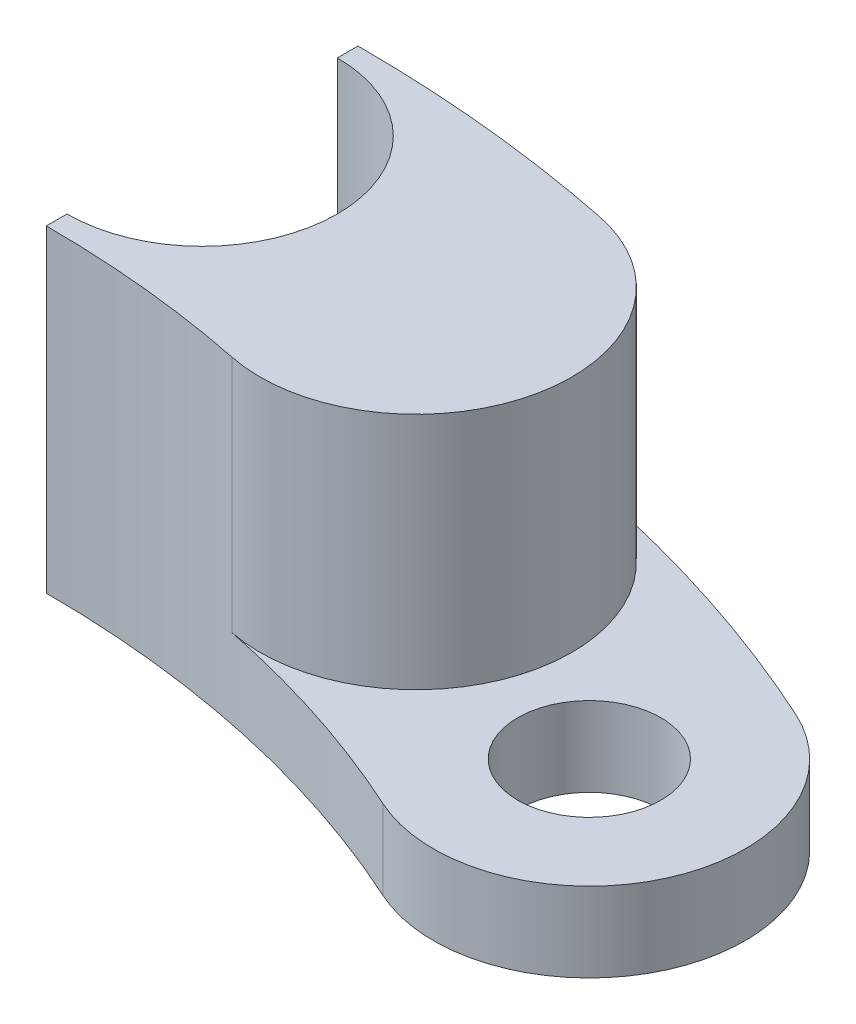
ISO-10303-21;
HEADER;
FILE_DESCRIPTION(('STEP AP214'),'2;1');
FILE_NAME('part.step','',(''),(''),'','','');
FILE_SCHEMA(('AUTOMOTIVE_DESIGN { 1 0 10303 214 1 1 1 1 }'));
ENDSEC;
DATA;
#1=APPLICATION_CONTEXT('core data for automotive mechanical design processes');
#2=APPLICATION_PROTOCOL_DEFINITION('international standard','automotive_design',2000,#1);
#3=PRODUCT_CONTEXT('',#1,'mechanical');
#4=PRODUCT('Part','Part','',(#3));
#5=PRODUCT_RELATED_PRODUCT_CATEGORY('part','',(#4));
#6=PRODUCT_DEFINITION_FORMATION('','',#4);
#7=PRODUCT_DEFINITION_CONTEXT('part definition',#1,'design');
#8=PRODUCT_DEFINITION('design','',#6,#7);
#9=PRODUCT_DEFINITION_SHAPE('','',#8);
#10=(LENGTH_UNIT() NAMED_UNIT(*) SI_UNIT(.MILLI.,.METRE.));
#11=(NAMED_UNIT(*) PLANE_ANGLE_UNIT() SI_UNIT($,.RADIAN.));
#12=(NAMED_UNIT(*) SI_UNIT($,.STERADIAN.) SOLID_ANGLE_UNIT());
#13=UNCERTAINTY_MEASURE_WITH_UNIT(LENGTH_MEASURE(1.E-05),#10,'distance_accuracy_value','');
#14=(GEOMETRIC_REPRESENTATION_CONTEXT(3) GLOBAL_UNCERTAINTY_ASSIGNED_CONTEXT((#13)) GLOBAL_UNIT_ASSIGNED_CONTEXT((#10,
#11,#12)) REPRESENTATION_CONTEXT('',''));
#15=CARTESIAN_POINT('',(0.,0.,0.));
#16=DIRECTION('',(0.,0.,1.));
#17=DIRECTION('',(1.,0.,0.));
#18=AXIS2_PLACEMENT_3D('',#15,#16,#17);
#19=CARTESIAN_POINT('',(0.,10.,0.));
#20=DIRECTION('',(0.,-1.,0.));
#21=DIRECTION('',(0.,0.,-1.));
#22=AXIS2_PLACEMENT_3D('',#19,#20,#21);
#23=CYLINDRICAL_SURFACE('',#22,32.6);
#24=CARTESIAN_POINT('',(0.,2.5,0.));
#25=DIRECTION('',(0.,1.,0.));
#26=DIRECTION('',(0.,0.,1.));
#27=AXIS2_PLACEMENT_3D('',#24,#25,#26);
#28=CIRCLE('',#27,32.6);
#29=CARTESIAN_POINT('',(6.49939466200064,2.5,-31.945545370639));
#30=VERTEX_POINT('',#29);
#31=CARTESIAN_POINT('',(13.5189997105934,2.5,-29.6647374305753));
#32=VERTEX_POINT('',#31);
#33=EDGE_CURVE('E124',#30,#32,#28,.F.);
#34=ORIENTED_EDGE('',*,*,#33,.F.);
#35=DIRECTION('',(0.,1.,0.));
#36=VECTOR('',#35,1.);
#37=CARTESIAN_POINT('',(6.49939466200064,2.5,-31.945545370639));
#38=LINE('',#37,#36);
#39=CARTESIAN_POINT('',(6.49939466200064,10.,-31.945545370639));
#40=VERTEX_POINT('',#39);
#41=EDGE_CURVE('E111',#30,#40,#38,.T.);
#42=ORIENTED_EDGE('',*,*,#41,.T.);
#43=CARTESIAN_POINT('',(0.,10.,0.));
#44=DIRECTION('',(0.,1.,0.));
#45=DIRECTION('',(0.,0.,1.));
#46=AXIS2_PLACEMENT_3D('',#43,#44,#45);
#47=CIRCLE('',#46,32.6);
#48=CARTESIAN_POINT('',(0.,10.,-32.6));
#49=VERTEX_POINT('',#48);
#50=EDGE_CURVE('E65',#40,#49,#47,.T.);
#51=ORIENTED_EDGE('',*,*,#50,.T.);
#52=DIRECTION('',(0.,-1.,0.));
#53=VECTOR('',#52,1.);
#54=CARTESIAN_POINT('',(0.,10.,-32.6));
#55=LINE('',#54,#53);
#56=CARTESIAN_POINT('',(0.,0.,-32.6));
#57=VERTEX_POINT('',#56);
#58=EDGE_CURVE('E89',#49,#57,#55,.T.);
#59=ORIENTED_EDGE('',*,*,#58,.T.);
#60=CARTESIAN_POINT('',(0.,0.,0.));
#61=DIRECTION('',(0.,1.,0.));
#62=DIRECTION('',(0.,0.,1.));
#63=AXIS2_PLACEMENT_3D('',#60,#61,#62);
#64=CIRCLE('',#63,32.6);
#65=CARTESIAN_POINT('',(13.5189997105934,0.,-29.6647374305753));
#66=VERTEX_POINT('',#65);
#67=EDGE_CURVE('E145',#66,#57,#64,.T.);
#68=ORIENTED_EDGE('',*,*,#67,.F.);
#69=DIRECTION('',(0.,-1.,0.));
#70=VECTOR('',#69,1.);
#71=CARTESIAN_POINT('',(13.5189997105934,10.,-29.6647374305753));
#72=LINE('',#71,#70);
#73=EDGE_CURVE('E11',#32,#66,#72,.T.);
#74=ORIENTED_EDGE('',*,*,#73,.F.);
#75=EDGE_LOOP('',(#34,#42,#51,#59,#68,#74));
#76=FACE_BOUND('',#75,.T.);
#77=ADVANCED_FACE('F41',(#76),#23,.F.);
#78=CARTESIAN_POINT('',(15.550996599609,10.,-34.1235476578704));
#79=DIRECTION('',(0.,-1.,0.));
#80=DIRECTION('',(0.,0.,-1.));
#81=AXIS2_PLACEMENT_3D('',#78,#79,#80);
#82=CYLINDRICAL_SURFACE('',#81,4.9);
#83=CARTESIAN_POINT('',(15.550996599609,2.5,-34.1235476578704));
#84=DIRECTION('',(0.,1.,0.));
#85=DIRECTION('',(0.,0.,1.));
#86=AXIS2_PLACEMENT_3D('',#83,#84,#85);
#87=CIRCLE('',#86,4.9);
#88=CARTESIAN_POINT('',(17.5829934886246,2.5,-38.5823578851654));
#89=VERTEX_POINT('',#88);
#90=EDGE_CURVE('E132',#32,#89,#87,.T.);
#91=ORIENTED_EDGE('',*,*,#90,.F.);
#92=ORIENTED_EDGE('',*,*,#73,.T.);
#93=CARTESIAN_POINT('',(15.550996599609,0.,-34.1235476578704));
#94=DIRECTION('',(0.,1.,0.));
#95=DIRECTION('',(0.,0.,1.));
#96=AXIS2_PLACEMENT_3D('',#93,#94,#95);
#97=CIRCLE('',#96,4.9);
#98=CARTESIAN_POINT('',(17.5829934886246,0.,-38.5823578851654));
#99=VERTEX_POINT('',#98);
#100=EDGE_CURVE('E163',#66,#99,#97,.T.);
#101=ORIENTED_EDGE('',*,*,#100,.T.);
#102=DIRECTION('',(0.,-1.,0.));
#103=VECTOR('',#102,1.);
#104=CARTESIAN_POINT('',(17.5829934886246,10.,-38.5823578851654));
#105=LINE('',#104,#103);
#106=EDGE_CURVE('E49',#89,#99,#105,.T.);
#107=ORIENTED_EDGE('',*,*,#106,.F.);
#108=EDGE_LOOP('',(#91,#92,#101,#107));
#109=FACE_BOUND('',#108,.T.);
#110=ADVANCED_FACE('F200',(#109),#82,.T.);
#111=CARTESIAN_POINT('',(0.,10.,0.));
#112=DIRECTION('',(0.,-1.,0.));
#113=DIRECTION('',(0.,0.,-1.));
#114=AXIS2_PLACEMENT_3D('',#111,#112,#113);
#115=CYLINDRICAL_SURFACE('',#114,42.4);
#116=DIRECTION('',(0.,1.,0.));
#117=VECTOR('',#116,1.);
#118=CARTESIAN_POINT('',(8.45320041928918,2.5,-41.5488074759232));
#119=LINE('',#118,#117);
#120=CARTESIAN_POINT('',(8.45320041928918,2.5,-41.5488074759232));
#121=VERTEX_POINT('',#120);
#122=CARTESIAN_POINT('',(8.45320041928918,10.,-41.5488074759232));
#123=VERTEX_POINT('',#122);
#124=EDGE_CURVE('E56',#121,#123,#119,.T.);
#125=ORIENTED_EDGE('',*,*,#124,.F.);
#126=CARTESIAN_POINT('',(0.,2.5,0.));
#127=DIRECTION('',(0.,1.,0.));
#128=DIRECTION('',(0.,0.,1.));
#129=AXIS2_PLACEMENT_3D('',#126,#127,#128);
#130=CIRCLE('',#129,42.4);
#131=EDGE_CURVE('E127',#89,#121,#130,.T.);
#132=ORIENTED_EDGE('',*,*,#131,.F.);
#133=ORIENTED_EDGE('',*,*,#106,.T.);
#134=CARTESIAN_POINT('',(0.,0.,0.));
#135=DIRECTION('',(0.,1.,0.));
#136=DIRECTION('',(0.,0.,1.));
#137=AXIS2_PLACEMENT_3D('',#134,#135,#136);
#138=CIRCLE('',#137,42.4);
#139=CARTESIAN_POINT('',(0.,0.,-42.4));
#140=VERTEX_POINT('',#139);
#141=EDGE_CURVE('E167',#99,#140,#138,.T.);
#142=ORIENTED_EDGE('',*,*,#141,.T.);
#143=DIRECTION('',(0.,-1.,0.));
#144=VECTOR('',#143,1.);
#145=CARTESIAN_POINT('',(0.,10.,-42.4));
#146=LINE('',#145,#144);
#147=CARTESIAN_POINT('',(0.,10.,-42.4));
#148=VERTEX_POINT('',#147);
#149=EDGE_CURVE('E191',#148,#140,#146,.T.);
#150=ORIENTED_EDGE('',*,*,#149,.F.);
#151=CARTESIAN_POINT('',(0.,10.,0.));
#152=DIRECTION('',(0.,1.,0.));
#153=DIRECTION('',(0.,0.,1.));
#154=AXIS2_PLACEMENT_3D('',#151,#152,#153);
#155=CIRCLE('',#154,42.4);
#156=EDGE_CURVE('E96',#123,#148,#155,.T.);
#157=ORIENTED_EDGE('',*,*,#156,.F.);
#158=EDGE_LOOP('',(#125,#132,#133,#142,#150,#157));
#159=FACE_BOUND('',#158,.T.);
#160=ADVANCED_FACE('F196',(#159),#115,.T.);
#161=CARTESIAN_POINT('',(15.550996599609,10.,-34.1235476578704));
#162=DIRECTION('',(0.,-1.,0.));
#163=DIRECTION('',(0.,0.,-1.));
#164=AXIS2_PLACEMENT_3D('',#161,#162,#163);
#165=CYLINDRICAL_SURFACE('',#164,2.25);
#166=CARTESIAN_POINT('',(15.550996599609,0.,-34.1235476578704));
#167=DIRECTION('',(0.,1.,0.));
#168=DIRECTION('',(0.,0.,1.));
#169=AXIS2_PLACEMENT_3D('',#166,#167,#168);
#170=CIRCLE('',#169,2.25);
#171=CARTESIAN_POINT('',(15.550996599609,0.,-31.8735476578704));
#172=VERTEX_POINT('',#171);
#173=EDGE_CURVE('E149',#172,#172,#170,.T.);
#174=ORIENTED_EDGE('',*,*,#173,.F.);
#175=EDGE_LOOP('',(#174));
#176=FACE_BOUND('',#175,.T.);
#177=CARTESIAN_POINT('',(15.550996599609,2.5,-34.1235476578704));
#178=DIRECTION('',(0.,1.,0.));
#179=DIRECTION('',(0.,0.,1.));
#180=AXIS2_PLACEMENT_3D('',#177,#178,#179);
#181=CIRCLE('',#180,2.25);
#182=CARTESIAN_POINT('',(15.550996599609,2.5,-31.8735476578704));
#183=VERTEX_POINT('',#182);
#184=EDGE_CURVE('E119',#183,#183,#181,.F.);
#185=ORIENTED_EDGE('',*,*,#184,.F.);
#186=EDGE_LOOP('',(#185));
#187=FACE_BOUND('',#186,.T.);
#188=ADVANCED_FACE('F237',(#176,#187),#165,.F.);
#189=CARTESIAN_POINT('',(0.,10.,0.));
#190=DIRECTION('',(0.,1.,0.));
#191=DIRECTION('',(0.,0.,1.));
#192=AXIS2_PLACEMENT_3D('',#189,#190,#191);
#193=PLANE('',#192);
#194=ORIENTED_EDGE('',*,*,#50,.F.);
#195=CARTESIAN_POINT('',(7.47629754064491,10.,-36.7471764232811));
#196=DIRECTION('',(0.,1.,0.));
#197=DIRECTION('',(0.,0.,1.));
#198=AXIS2_PLACEMENT_3D('',#195,#196,#197);
#199=CIRCLE('',#198,4.9);
#200=EDGE_CURVE('E116',#40,#123,#199,.T.);
#201=ORIENTED_EDGE('',*,*,#200,.T.);
#202=ORIENTED_EDGE('',*,*,#156,.T.);
#203=DIRECTION('',(0.,0.,-1.));
#204=VECTOR('',#203,1.);
#205=CARTESIAN_POINT('',(0.,10.,0.));
#206=LINE('',#205,#204);
#207=CARTESIAN_POINT('',(0.,10.,-41.75));
#208=VERTEX_POINT('',#207);
#209=EDGE_CURVE('E152',#208,#148,#206,.T.);
#210=ORIENTED_EDGE('',*,*,#209,.F.);
#211=CARTESIAN_POINT('',(0.,10.,-37.5));
#212=DIRECTION('',(0.,1.,0.));
#213=DIRECTION('',(0.,0.,1.));
#214=AXIS2_PLACEMENT_3D('',#211,#212,#213);
#215=CIRCLE('',#214,4.25);
#216=CARTESIAN_POINT('',(0.,10.,-33.25));
#217=VERTEX_POINT('',#216);
#218=EDGE_CURVE('E156',#217,#208,#215,.T.);
#219=ORIENTED_EDGE('',*,*,#218,.F.);
#220=EDGE_CURVE('E157',#49,#217,#206,.T.);
#221=ORIENTED_EDGE('',*,*,#220,.F.);
#222=EDGE_LOOP('',(#194,#201,#202,#210,#219,#221));
#223=FACE_BOUND('',#222,.T.);
#224=ADVANCED_FACE('F210',(#223),#193,.T.);
#225=CARTESIAN_POINT('',(0.,10.,0.));
#226=DIRECTION('',(-1.,0.,0.));
#227=DIRECTION('',(0.,0.,1.));
#228=AXIS2_PLACEMENT_3D('',#225,#226,#227);
#229=PLANE('',#228);
#230=DIRECTION('',(0.,0.,-1.));
#231=VECTOR('',#230,1.);
#232=CARTESIAN_POINT('',(0.,0.,0.));
#233=LINE('',#232,#231);
#234=CARTESIAN_POINT('',(0.,0.,-41.75));
#235=VERTEX_POINT('',#234);
#236=EDGE_CURVE('E171',#235,#140,#233,.T.);
#237=ORIENTED_EDGE('',*,*,#236,.F.);
#238=DIRECTION('',(0.,-1.,0.));
#239=VECTOR('',#238,1.);
#240=CARTESIAN_POINT('',(0.,10.,-41.75));
#241=LINE('',#240,#239);
#242=EDGE_CURVE('E188',#208,#235,#241,.T.);
#243=ORIENTED_EDGE('',*,*,#242,.F.);
#244=ORIENTED_EDGE('',*,*,#209,.T.);
#245=ORIENTED_EDGE('',*,*,#149,.T.);
#246=EDGE_LOOP('',(#237,#243,#244,#245));
#247=FACE_BOUND('',#246,.T.);
#248=ADVANCED_FACE('F208',(#247),#229,.T.);
#249=CARTESIAN_POINT('',(0.,10.,-37.5));
#250=DIRECTION('',(0.,-1.,0.));
#251=DIRECTION('',(0.,0.,-1.));
#252=AXIS2_PLACEMENT_3D('',#249,#250,#251);
#253=CYLINDRICAL_SURFACE('',#252,4.25);
#254=CARTESIAN_POINT('',(0.,0.,-37.5));
#255=DIRECTION('',(0.,1.,0.));
#256=DIRECTION('',(0.,0.,1.));
#257=AXIS2_PLACEMENT_3D('',#254,#255,#256);
#258=CIRCLE('',#257,4.25);
#259=CARTESIAN_POINT('',(0.,0.,-33.25));
#260=VERTEX_POINT('',#259);
#261=EDGE_CURVE('E175',#260,#235,#258,.T.);
#262=ORIENTED_EDGE('',*,*,#261,.F.);
#263=DIRECTION('',(0.,-1.,0.));
#264=VECTOR('',#263,1.);
#265=CARTESIAN_POINT('',(0.,10.,-33.25));
#266=LINE('',#265,#264);
#267=EDGE_CURVE('E185',#217,#260,#266,.T.);
#268=ORIENTED_EDGE('',*,*,#267,.F.);
#269=ORIENTED_EDGE('',*,*,#218,.T.);
#270=ORIENTED_EDGE('',*,*,#242,.T.);
#271=EDGE_LOOP('',(#262,#268,#269,#270));
#272=FACE_BOUND('',#271,.T.);
#273=ADVANCED_FACE('F214',(#272),#253,.F.);
#274=EDGE_CURVE('E176',#57,#260,#233,.T.);
#275=ORIENTED_EDGE('',*,*,#274,.F.);
#276=ORIENTED_EDGE('',*,*,#58,.F.);
#277=ORIENTED_EDGE('',*,*,#220,.T.);
#278=ORIENTED_EDGE('',*,*,#267,.T.);
#279=EDGE_LOOP('',(#275,#276,#277,#278));
#280=FACE_BOUND('',#279,.T.);
#281=ADVANCED_FACE('F217',(#280),#229,.T.);
#282=CARTESIAN_POINT('',(0.,0.,0.));
#283=DIRECTION('',(0.,1.,0.));
#284=DIRECTION('',(0.,0.,1.));
#285=AXIS2_PLACEMENT_3D('',#282,#283,#284);
#286=PLANE('',#285);
#287=ORIENTED_EDGE('',*,*,#67,.T.);
#288=ORIENTED_EDGE('',*,*,#274,.T.);
#289=ORIENTED_EDGE('',*,*,#261,.T.);
#290=ORIENTED_EDGE('',*,*,#236,.T.);
#291=ORIENTED_EDGE('',*,*,#141,.F.);
#292=ORIENTED_EDGE('',*,*,#100,.F.);
#293=EDGE_LOOP('',(#287,#288,#289,#290,#291,#292));
#294=FACE_BOUND('',#293,.T.);
#295=ORIENTED_EDGE('',*,*,#173,.T.);
#296=EDGE_LOOP('',(#295));
#297=FACE_BOUND('',#296,.T.);
#298=ADVANCED_FACE('F202',(#294,#297),#286,.F.);
#299=CARTESIAN_POINT('',(7.47629754064491,2.5,-36.7471764232811));
#300=DIRECTION('',(0.,1.,0.));
#301=DIRECTION('',(0.,0.,1.));
#302=AXIS2_PLACEMENT_3D('',#299,#300,#301);
#303=CYLINDRICAL_SURFACE('',#302,4.9);
#304=ORIENTED_EDGE('',*,*,#200,.F.);
#305=ORIENTED_EDGE('',*,*,#41,.F.);
#306=CARTESIAN_POINT('',(7.47629754064491,2.5,-36.7471764232811));
#307=DIRECTION('',(0.,1.,0.));
#308=DIRECTION('',(0.,0.,1.));
#309=AXIS2_PLACEMENT_3D('',#306,#307,#308);
#310=CIRCLE('',#309,4.9);
#311=EDGE_CURVE('E114',#30,#121,#310,.T.);
#312=ORIENTED_EDGE('',*,*,#311,.T.);
#313=ORIENTED_EDGE('',*,*,#124,.T.);
#314=EDGE_LOOP('',(#304,#305,#312,#313));
#315=FACE_BOUND('',#314,.T.);
#316=ADVANCED_FACE('F113',(#315),#303,.T.);
#317=CARTESIAN_POINT('',(0.,2.5,0.));
#318=DIRECTION('',(0.,1.,0.));
#319=DIRECTION('',(0.,0.,1.));
#320=AXIS2_PLACEMENT_3D('',#317,#318,#319);
#321=PLANE('',#320);
#322=ORIENTED_EDGE('',*,*,#311,.F.);
#323=ORIENTED_EDGE('',*,*,#33,.T.);
#324=ORIENTED_EDGE('',*,*,#90,.T.);
#325=ORIENTED_EDGE('',*,*,#131,.T.);
#326=EDGE_LOOP('',(#322,#323,#324,#325));
#327=FACE_BOUND('',#326,.T.);
#328=ORIENTED_EDGE('',*,*,#184,.T.);
#329=EDGE_LOOP('',(#328));
#330=FACE_BOUND('',#329,.T.);
#331=ADVANCED_FACE('F122',(#327,#330),#321,.T.);
#332=CLOSED_SHELL('',(#77,#110,#160,#188,#224,#248,#273,#281,#298,#316,#331));
#333=MANIFOLD_SOLID_BREP('B2',#332);
#334=ADVANCED_BREP_SHAPE_REPRESENTATION('',(#18,#333),#14);
#335=SHAPE_DEFINITION_REPRESENTATION(#9,#334);
ENDSEC;
END-ISO-10303-21;
